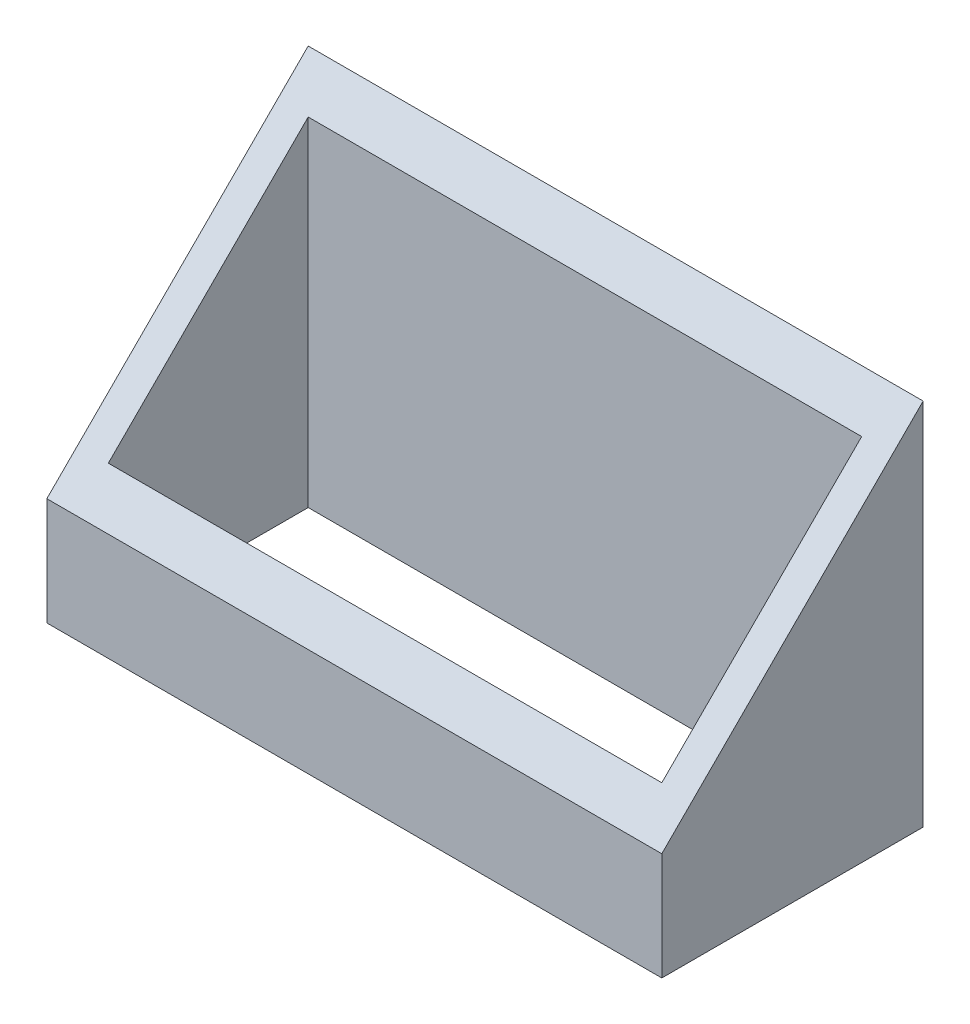
ISO-10303-21;
HEADER;
FILE_DESCRIPTION(('STEP AP214'),'2;1');
FILE_NAME('part.step','',(''),(''),'','','');
FILE_SCHEMA(('AUTOMOTIVE_DESIGN { 1 0 10303 214 1 1 1 1 }'));
ENDSEC;
DATA;
#1=APPLICATION_CONTEXT('core data for automotive mechanical design processes');
#2=APPLICATION_PROTOCOL_DEFINITION('international standard','automotive_design',2000,#1);
#3=PRODUCT_CONTEXT('',#1,'mechanical');
#4=PRODUCT('Part','Part','',(#3));
#5=PRODUCT_RELATED_PRODUCT_CATEGORY('part','',(#4));
#6=PRODUCT_DEFINITION_FORMATION('','',#4);
#7=PRODUCT_DEFINITION_CONTEXT('part definition',#1,'design');
#8=PRODUCT_DEFINITION('design','',#6,#7);
#9=PRODUCT_DEFINITION_SHAPE('','',#8);
#10=(LENGTH_UNIT() NAMED_UNIT(*) SI_UNIT(.MILLI.,.METRE.));
#11=(NAMED_UNIT(*) PLANE_ANGLE_UNIT() SI_UNIT($,.RADIAN.));
#12=(NAMED_UNIT(*) SI_UNIT($,.STERADIAN.) SOLID_ANGLE_UNIT());
#13=UNCERTAINTY_MEASURE_WITH_UNIT(LENGTH_MEASURE(1.E-05),#10,'distance_accuracy_value','');
#14=(GEOMETRIC_REPRESENTATION_CONTEXT(3) GLOBAL_UNCERTAINTY_ASSIGNED_CONTEXT((#13)) GLOBAL_UNIT_ASSIGNED_CONTEXT((#10,
#11,#12)) REPRESENTATION_CONTEXT('',''));
#15=CARTESIAN_POINT('',(0.,0.,0.));
#16=DIRECTION('',(0.,0.,1.));
#17=DIRECTION('',(1.,0.,0.));
#18=AXIS2_PLACEMENT_3D('',#15,#16,#17);
#19=CARTESIAN_POINT('',(100.,0.,0.));
#20=DIRECTION('',(0.,0.,-1.));
#21=DIRECTION('',(0.,1.,0.));
#22=AXIS2_PLACEMENT_3D('',#19,#20,#21);
#23=PLANE('',#22);
#24=DIRECTION('',(0.,-1.,0.));
#25=VECTOR('',#24,1.);
#26=CARTESIAN_POINT('',(0.,0.,0.));
#27=LINE('',#26,#25);
#28=CARTESIAN_POINT('',(0.,17.5000000000004,0.));
#29=VERTEX_POINT('',#28);
#30=CARTESIAN_POINT('',(0.,0.,0.));
#31=VERTEX_POINT('',#30);
#32=EDGE_CURVE('E135',#29,#31,#27,.T.);
#33=ORIENTED_EDGE('',*,*,#32,.T.);
#34=DIRECTION('',(-1.,0.,0.));
#35=VECTOR('',#34,1.);
#36=CARTESIAN_POINT('',(100.,0.,0.));
#37=LINE('',#36,#35);
#38=CARTESIAN_POINT('',(100.,0.,0.));
#39=VERTEX_POINT('',#38);
#40=EDGE_CURVE('E177',#39,#31,#37,.T.);
#41=ORIENTED_EDGE('',*,*,#40,.F.);
#42=DIRECTION('',(0.,-1.,0.));
#43=VECTOR('',#42,1.);
#44=CARTESIAN_POINT('',(100.,0.,0.));
#45=LINE('',#44,#43);
#46=CARTESIAN_POINT('',(100.,17.5000000000004,0.));
#47=VERTEX_POINT('',#46);
#48=EDGE_CURVE('E140',#47,#39,#45,.T.);
#49=ORIENTED_EDGE('',*,*,#48,.F.);
#50=DIRECTION('',(-1.,0.,0.));
#51=VECTOR('',#50,1.);
#52=CARTESIAN_POINT('',(100.,17.5000000000004,0.));
#53=LINE('',#52,#51);
#54=EDGE_CURVE('E154',#47,#29,#53,.T.);
#55=ORIENTED_EDGE('',*,*,#54,.T.);
#56=EDGE_LOOP('',(#33,#41,#49,#55));
#57=FACE_BOUND('',#56,.T.);
#58=ADVANCED_FACE('F39',(#57),#23,.F.);
#59=CARTESIAN_POINT('',(100.,0.,0.));
#60=DIRECTION('',(0.,1.,0.));
#61=DIRECTION('',(0.,0.,1.));
#62=AXIS2_PLACEMENT_3D('',#59,#60,#61);
#63=PLANE('',#62);
#64=DIRECTION('',(1.,0.,0.));
#65=VECTOR('',#64,1.);
#66=CARTESIAN_POINT('',(5.,0.,-37.5));
#67=LINE('',#66,#65);
#68=CARTESIAN_POINT('',(5.,0.,-37.5));
#69=VERTEX_POINT('',#68);
#70=CARTESIAN_POINT('',(95.,0.,-37.5));
#71=VERTEX_POINT('',#70);
#72=EDGE_CURVE('E117',#69,#71,#67,.T.);
#73=ORIENTED_EDGE('',*,*,#72,.F.);
#74=DIRECTION('',(0.,0.,-1.));
#75=VECTOR('',#74,1.);
#76=CARTESIAN_POINT('',(5.,0.,-5.));
#77=LINE('',#76,#75);
#78=CARTESIAN_POINT('',(5.,0.,-5.));
#79=VERTEX_POINT('',#78);
#80=EDGE_CURVE('E54',#79,#69,#77,.T.);
#81=ORIENTED_EDGE('',*,*,#80,.F.);
#82=DIRECTION('',(-1.,0.,0.));
#83=VECTOR('',#82,1.);
#84=CARTESIAN_POINT('',(5.,0.,-5.));
#85=LINE('',#84,#83);
#86=CARTESIAN_POINT('',(95.,0.,-5.));
#87=VERTEX_POINT('',#86);
#88=EDGE_CURVE('E125',#87,#79,#85,.T.);
#89=ORIENTED_EDGE('',*,*,#88,.F.);
#90=DIRECTION('',(0.,0.,1.));
#91=VECTOR('',#90,1.);
#92=CARTESIAN_POINT('',(95.,0.,-5.));
#93=LINE('',#92,#91);
#94=EDGE_CURVE('E107',#71,#87,#93,.T.);
#95=ORIENTED_EDGE('',*,*,#94,.F.);
#96=EDGE_LOOP('',(#73,#81,#89,#95));
#97=FACE_BOUND('',#96,.T.);
#98=DIRECTION('',(0.,0.,-1.));
#99=VECTOR('',#98,1.);
#100=CARTESIAN_POINT('',(0.,0.,0.));
#101=LINE('',#100,#99);
#102=CARTESIAN_POINT('',(0.,0.,-42.5));
#103=VERTEX_POINT('',#102);
#104=EDGE_CURVE('E158',#31,#103,#101,.T.);
#105=ORIENTED_EDGE('',*,*,#104,.T.);
#106=DIRECTION('',(-1.,0.,0.));
#107=VECTOR('',#106,1.);
#108=CARTESIAN_POINT('',(100.,0.,-42.5));
#109=LINE('',#108,#107);
#110=CARTESIAN_POINT('',(100.,0.,-42.5));
#111=VERTEX_POINT('',#110);
#112=EDGE_CURVE('E173',#111,#103,#109,.T.);
#113=ORIENTED_EDGE('',*,*,#112,.F.);
#114=DIRECTION('',(0.,0.,-1.));
#115=VECTOR('',#114,1.);
#116=CARTESIAN_POINT('',(100.,0.,0.));
#117=LINE('',#116,#115);
#118=EDGE_CURVE('E144',#39,#111,#117,.T.);
#119=ORIENTED_EDGE('',*,*,#118,.F.);
#120=ORIENTED_EDGE('',*,*,#40,.T.);
#121=EDGE_LOOP('',(#105,#113,#119,#120));
#122=FACE_BOUND('',#121,.T.);
#123=ADVANCED_FACE('F122',(#97,#122),#63,.F.);
#124=CARTESIAN_POINT('',(100.,0.,-42.5));
#125=DIRECTION('',(0.,0.,1.));
#126=DIRECTION('',(1.,0.,0.));
#127=AXIS2_PLACEMENT_3D('',#124,#125,#126);
#128=PLANE('',#127);
#129=DIRECTION('',(0.,1.,0.));
#130=VECTOR('',#129,1.);
#131=CARTESIAN_POINT('',(0.,0.,-42.5));
#132=LINE('',#131,#130);
#133=CARTESIAN_POINT('',(0.,60.,-42.5));
#134=VERTEX_POINT('',#133);
#135=EDGE_CURVE('E161',#103,#134,#132,.T.);
#136=ORIENTED_EDGE('',*,*,#135,.T.);
#137=DIRECTION('',(-1.,0.,0.));
#138=VECTOR('',#137,1.);
#139=CARTESIAN_POINT('',(100.,60.,-42.5));
#140=LINE('',#139,#138);
#141=CARTESIAN_POINT('',(100.,60.,-42.5));
#142=VERTEX_POINT('',#141);
#143=EDGE_CURVE('E169',#142,#134,#140,.T.);
#144=ORIENTED_EDGE('',*,*,#143,.F.);
#145=DIRECTION('',(0.,1.,0.));
#146=VECTOR('',#145,1.);
#147=CARTESIAN_POINT('',(100.,0.,-42.5));
#148=LINE('',#147,#146);
#149=EDGE_CURVE('E148',#111,#142,#148,.T.);
#150=ORIENTED_EDGE('',*,*,#149,.F.);
#151=ORIENTED_EDGE('',*,*,#112,.T.);
#152=EDGE_LOOP('',(#136,#144,#150,#151));
#153=FACE_BOUND('',#152,.T.);
#154=ADVANCED_FACE('F212',(#153),#128,.F.);
#155=CARTESIAN_POINT('',(100.,60.,-42.5));
#156=DIRECTION('',(0.,-0.707106781186551,-0.707106781186544));
#157=DIRECTION('',(0.,0.707106781186544,-0.707106781186551));
#158=AXIS2_PLACEMENT_3D('',#155,#156,#157);
#159=PLANE('',#158);
#160=DIRECTION('',(-1.,0.,0.));
#161=VECTOR('',#160,1.);
#162=CARTESIAN_POINT('',(100.,22.5000000000004,-5.));
#163=LINE('',#162,#161);
#164=CARTESIAN_POINT('',(95.,22.5000000000004,-5.));
#165=VERTEX_POINT('',#164);
#166=CARTESIAN_POINT('',(5.,22.5000000000004,-5.));
#167=VERTEX_POINT('',#166);
#168=EDGE_CURVE('E47',#165,#167,#163,.T.);
#169=ORIENTED_EDGE('',*,*,#168,.T.);
#170=DIRECTION('',(0.,0.707106781186544,-0.707106781186551));
#171=VECTOR('',#170,1.);
#172=CARTESIAN_POINT('',(5.,60.,-42.5));
#173=LINE('',#172,#171);
#174=CARTESIAN_POINT('',(5.,55.,-37.5));
#175=VERTEX_POINT('',#174);
#176=EDGE_CURVE('E11',#167,#175,#173,.T.);
#177=ORIENTED_EDGE('',*,*,#176,.T.);
#178=DIRECTION('',(1.,0.,0.));
#179=VECTOR('',#178,1.);
#180=CARTESIAN_POINT('',(100.,55.,-37.5));
#181=LINE('',#180,#179);
#182=CARTESIAN_POINT('',(95.,55.,-37.5));
#183=VERTEX_POINT('',#182);
#184=EDGE_CURVE('E181',#175,#183,#181,.T.);
#185=ORIENTED_EDGE('',*,*,#184,.T.);
#186=DIRECTION('',(0.,-0.707106781186544,0.707106781186551));
#187=VECTOR('',#186,1.);
#188=CARTESIAN_POINT('',(95.,60.,-42.5));
#189=LINE('',#188,#187);
#190=EDGE_CURVE('E110',#183,#165,#189,.T.);
#191=ORIENTED_EDGE('',*,*,#190,.T.);
#192=EDGE_LOOP('',(#169,#177,#185,#191));
#193=FACE_BOUND('',#192,.T.);
#194=DIRECTION('',(0.,-0.707106781186544,0.707106781186551));
#195=VECTOR('',#194,1.);
#196=CARTESIAN_POINT('',(0.,60.,-42.5));
#197=LINE('',#196,#195);
#198=EDGE_CURVE('E145',#134,#29,#197,.T.);
#199=ORIENTED_EDGE('',*,*,#198,.T.);
#200=ORIENTED_EDGE('',*,*,#54,.F.);
#201=DIRECTION('',(0.,-0.707106781186544,0.707106781186551));
#202=VECTOR('',#201,1.);
#203=CARTESIAN_POINT('',(100.,60.,-42.5));
#204=LINE('',#203,#202);
#205=EDGE_CURVE('E151',#142,#47,#204,.T.);
#206=ORIENTED_EDGE('',*,*,#205,.F.);
#207=ORIENTED_EDGE('',*,*,#143,.T.);
#208=EDGE_LOOP('',(#199,#200,#206,#207));
#209=FACE_BOUND('',#208,.T.);
#210=ADVANCED_FACE('F188',(#193,#209),#159,.F.);
#211=CARTESIAN_POINT('',(100.,0.,0.));
#212=DIRECTION('',(-1.,0.,0.));
#213=DIRECTION('',(0.,0.,1.));
#214=AXIS2_PLACEMENT_3D('',#211,#212,#213);
#215=PLANE('',#214);
#216=ORIENTED_EDGE('',*,*,#48,.T.);
#217=ORIENTED_EDGE('',*,*,#118,.T.);
#218=ORIENTED_EDGE('',*,*,#149,.T.);
#219=ORIENTED_EDGE('',*,*,#205,.T.);
#220=EDGE_LOOP('',(#216,#217,#218,#219));
#221=FACE_BOUND('',#220,.T.);
#222=ADVANCED_FACE('F202',(#221),#215,.F.);
#223=CARTESIAN_POINT('',(0.,0.,0.));
#224=DIRECTION('',(-1.,0.,0.));
#225=DIRECTION('',(0.,0.,1.));
#226=AXIS2_PLACEMENT_3D('',#223,#224,#225);
#227=PLANE('',#226);
#228=ORIENTED_EDGE('',*,*,#32,.F.);
#229=ORIENTED_EDGE('',*,*,#198,.F.);
#230=ORIENTED_EDGE('',*,*,#135,.F.);
#231=ORIENTED_EDGE('',*,*,#104,.F.);
#232=EDGE_LOOP('',(#228,#229,#230,#231));
#233=FACE_BOUND('',#232,.T.);
#234=ADVANCED_FACE('F195',(#233),#227,.T.);
#235=CARTESIAN_POINT('',(5.,60.,-5.));
#236=DIRECTION('',(-1.,0.,0.));
#237=DIRECTION('',(0.,0.,1.));
#238=AXIS2_PLACEMENT_3D('',#235,#236,#237);
#239=PLANE('',#238);
#240=DIRECTION('',(0.,-1.,0.));
#241=VECTOR('',#240,1.);
#242=CARTESIAN_POINT('',(5.,60.,-5.));
#243=LINE('',#242,#241);
#244=EDGE_CURVE('E132',#167,#79,#243,.T.);
#245=ORIENTED_EDGE('',*,*,#244,.T.);
#246=ORIENTED_EDGE('',*,*,#80,.T.);
#247=DIRECTION('',(0.,-1.,0.));
#248=VECTOR('',#247,1.);
#249=CARTESIAN_POINT('',(5.,60.,-37.5));
#250=LINE('',#249,#248);
#251=EDGE_CURVE('E114',#175,#69,#250,.T.);
#252=ORIENTED_EDGE('',*,*,#251,.F.);
#253=ORIENTED_EDGE('',*,*,#176,.F.);
#254=EDGE_LOOP('',(#245,#246,#252,#253));
#255=FACE_BOUND('',#254,.T.);
#256=ADVANCED_FACE('F193',(#255),#239,.F.);
#257=CARTESIAN_POINT('',(5.,60.,-5.));
#258=DIRECTION('',(0.,0.,1.));
#259=DIRECTION('',(1.,0.,0.));
#260=AXIS2_PLACEMENT_3D('',#257,#258,#259);
#261=PLANE('',#260);
#262=DIRECTION('',(0.,-1.,0.));
#263=VECTOR('',#262,1.);
#264=CARTESIAN_POINT('',(95.,60.,-5.));
#265=LINE('',#264,#263);
#266=EDGE_CURVE('E113',#165,#87,#265,.T.);
#267=ORIENTED_EDGE('',*,*,#266,.T.);
#268=ORIENTED_EDGE('',*,*,#88,.T.);
#269=ORIENTED_EDGE('',*,*,#244,.F.);
#270=ORIENTED_EDGE('',*,*,#168,.F.);
#271=EDGE_LOOP('',(#267,#268,#269,#270));
#272=FACE_BOUND('',#271,.T.);
#273=ADVANCED_FACE('F192',(#272),#261,.F.);
#274=CARTESIAN_POINT('',(95.,60.,-5.));
#275=DIRECTION('',(1.,0.,0.));
#276=DIRECTION('',(0.,0.,-1.));
#277=AXIS2_PLACEMENT_3D('',#274,#275,#276);
#278=PLANE('',#277);
#279=DIRECTION('',(0.,-1.,0.));
#280=VECTOR('',#279,1.);
#281=CARTESIAN_POINT('',(95.,60.,-37.5));
#282=LINE('',#281,#280);
#283=EDGE_CURVE('E62',#183,#71,#282,.T.);
#284=ORIENTED_EDGE('',*,*,#283,.T.);
#285=ORIENTED_EDGE('',*,*,#94,.T.);
#286=ORIENTED_EDGE('',*,*,#266,.F.);
#287=ORIENTED_EDGE('',*,*,#190,.F.);
#288=EDGE_LOOP('',(#284,#285,#286,#287));
#289=FACE_BOUND('',#288,.T.);
#290=ADVANCED_FACE('F104',(#289),#278,.F.);
#291=CARTESIAN_POINT('',(5.,60.,-37.5));
#292=DIRECTION('',(0.,0.,-1.));
#293=DIRECTION('',(-1.,0.,0.));
#294=AXIS2_PLACEMENT_3D('',#291,#292,#293);
#295=PLANE('',#294);
#296=ORIENTED_EDGE('',*,*,#251,.T.);
#297=ORIENTED_EDGE('',*,*,#72,.T.);
#298=ORIENTED_EDGE('',*,*,#283,.F.);
#299=ORIENTED_EDGE('',*,*,#184,.F.);
#300=EDGE_LOOP('',(#296,#297,#298,#299));
#301=FACE_BOUND('',#300,.T.);
#302=ADVANCED_FACE('F118',(#301),#295,.F.);
#303=CLOSED_SHELL('',(#58,#123,#154,#210,#222,#234,#256,#273,#290,#302));
#304=MANIFOLD_SOLID_BREP('B2',#303);
#305=ADVANCED_BREP_SHAPE_REPRESENTATION('',(#18,#304),#14);
#306=SHAPE_DEFINITION_REPRESENTATION(#9,#305);
ENDSEC;
END-ISO-10303-21;
